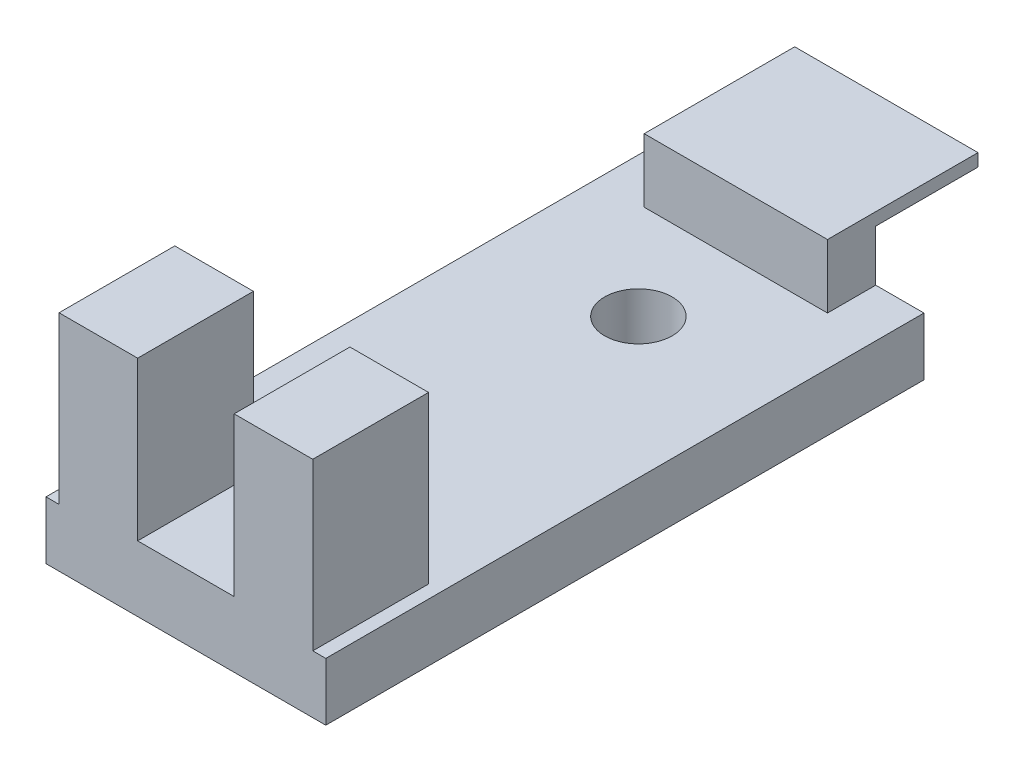
ISO-10303-21;
HEADER;
FILE_DESCRIPTION(('STEP AP214'),'2;1');
FILE_NAME('part.step','',(''),(''),'','','');
FILE_SCHEMA(('AUTOMOTIVE_DESIGN { 1 0 10303 214 1 1 1 1 }'));
ENDSEC;
DATA;
#1=APPLICATION_CONTEXT('core data for automotive mechanical design processes');
#2=APPLICATION_PROTOCOL_DEFINITION('international standard','automotive_design',2000,#1);
#3=PRODUCT_CONTEXT('',#1,'mechanical');
#4=PRODUCT('Part','Part','',(#3));
#5=PRODUCT_RELATED_PRODUCT_CATEGORY('part','',(#4));
#6=PRODUCT_DEFINITION_FORMATION('','',#4);
#7=PRODUCT_DEFINITION_CONTEXT('part definition',#1,'design');
#8=PRODUCT_DEFINITION('design','',#6,#7);
#9=PRODUCT_DEFINITION_SHAPE('','',#8);
#10=(LENGTH_UNIT() NAMED_UNIT(*) SI_UNIT(.MILLI.,.METRE.));
#11=(NAMED_UNIT(*) PLANE_ANGLE_UNIT() SI_UNIT($,.RADIAN.));
#12=(NAMED_UNIT(*) SI_UNIT($,.STERADIAN.) SOLID_ANGLE_UNIT());
#13=UNCERTAINTY_MEASURE_WITH_UNIT(LENGTH_MEASURE(1.E-05),#10,'distance_accuracy_value','');
#14=(GEOMETRIC_REPRESENTATION_CONTEXT(3) GLOBAL_UNCERTAINTY_ASSIGNED_CONTEXT((#13)) GLOBAL_UNIT_ASSIGNED_CONTEXT((#10,
#11,#12)) REPRESENTATION_CONTEXT('',''));
#15=CARTESIAN_POINT('',(0.,0.,0.));
#16=DIRECTION('',(0.,0.,1.));
#17=DIRECTION('',(1.,0.,0.));
#18=AXIS2_PLACEMENT_3D('',#15,#16,#17);
#19=CARTESIAN_POINT('',(-7.25,11.6,9.5));
#20=DIRECTION('',(0.,1.,0.));
#21=DIRECTION('',(0.,0.,1.));
#22=AXIS2_PLACEMENT_3D('',#19,#20,#21);
#23=PLANE('',#22);
#24=DIRECTION('',(0.,0.,1.));
#25=VECTOR('',#24,1.);
#26=CARTESIAN_POINT('',(-2.5,11.6,9.50000000000001));
#27=LINE('',#26,#25);
#28=CARTESIAN_POINT('',(-2.5,11.6,9.50000000000001));
#29=VERTEX_POINT('',#28);
#30=CARTESIAN_POINT('',(-2.5,11.6,15.5));
#31=VERTEX_POINT('',#30);
#32=EDGE_CURVE('E164',#29,#31,#27,.T.);
#33=ORIENTED_EDGE('',*,*,#32,.F.);
#34=DIRECTION('',(1.,0.,0.));
#35=VECTOR('',#34,1.);
#36=CARTESIAN_POINT('',(-7.25,11.6,9.5));
#37=LINE('',#36,#35);
#38=CARTESIAN_POINT('',(-6.575,11.6,9.5));
#39=VERTEX_POINT('',#38);
#40=EDGE_CURVE('E274',#39,#29,#37,.T.);
#41=ORIENTED_EDGE('',*,*,#40,.F.);
#42=DIRECTION('',(0.,0.,-1.));
#43=VECTOR('',#42,1.);
#44=CARTESIAN_POINT('',(-6.575,11.6,0.));
#45=LINE('',#44,#43);
#46=CARTESIAN_POINT('',(-6.575,11.6,15.5));
#47=VERTEX_POINT('',#46);
#48=EDGE_CURVE('E224',#47,#39,#45,.T.);
#49=ORIENTED_EDGE('',*,*,#48,.F.);
#50=DIRECTION('',(1.,0.,0.));
#51=VECTOR('',#50,1.);
#52=CARTESIAN_POINT('',(-7.25,11.6,15.5));
#53=LINE('',#52,#51);
#54=EDGE_CURVE('E271',#47,#31,#53,.T.);
#55=ORIENTED_EDGE('',*,*,#54,.T.);
#56=EDGE_LOOP('',(#33,#41,#49,#55));
#57=FACE_BOUND('',#56,.T.);
#58=ADVANCED_FACE('F33',(#57),#23,.T.);
#59=CARTESIAN_POINT('',(-7.25,11.6,15.5));
#60=DIRECTION('',(0.,0.,1.));
#61=DIRECTION('',(0.,-1.,0.));
#62=AXIS2_PLACEMENT_3D('',#59,#60,#61);
#63=PLANE('',#62);
#64=DIRECTION('',(0.,1.,0.));
#65=VECTOR('',#64,1.);
#66=CARTESIAN_POINT('',(-2.5,3.4,15.5));
#67=LINE('',#66,#65);
#68=CARTESIAN_POINT('',(-2.5,3.4,15.5));
#69=VERTEX_POINT('',#68);
#70=EDGE_CURVE('E159',#69,#31,#67,.T.);
#71=ORIENTED_EDGE('',*,*,#70,.T.);
#72=ORIENTED_EDGE('',*,*,#54,.F.);
#73=DIRECTION('',(0.,-1.,0.));
#74=VECTOR('',#73,1.);
#75=CARTESIAN_POINT('',(-6.575,11.6,15.5));
#76=LINE('',#75,#74);
#77=CARTESIAN_POINT('',(-6.575,3.,15.5));
#78=VERTEX_POINT('',#77);
#79=EDGE_CURVE('E232',#47,#78,#76,.T.);
#80=ORIENTED_EDGE('',*,*,#79,.T.);
#81=DIRECTION('',(1.,0.,0.));
#82=VECTOR('',#81,1.);
#83=CARTESIAN_POINT('',(0.,3.,15.5));
#84=LINE('',#83,#82);
#85=CARTESIAN_POINT('',(-7.25,3.,15.5));
#86=VERTEX_POINT('',#85);
#87=EDGE_CURVE('E209',#86,#78,#84,.T.);
#88=ORIENTED_EDGE('',*,*,#87,.F.);
#89=DIRECTION('',(0.,-1.,0.));
#90=VECTOR('',#89,1.);
#91=CARTESIAN_POINT('',(-7.25,11.6,15.5));
#92=LINE('',#91,#90);
#93=CARTESIAN_POINT('',(-7.25,0.,15.5));
#94=VERTEX_POINT('',#93);
#95=EDGE_CURVE('E261',#86,#94,#92,.T.);
#96=ORIENTED_EDGE('',*,*,#95,.T.);
#97=DIRECTION('',(1.,0.,0.));
#98=VECTOR('',#97,1.);
#99=CARTESIAN_POINT('',(-7.25,0.,15.5));
#100=LINE('',#99,#98);
#101=CARTESIAN_POINT('',(7.25,0.,15.5));
#102=VERTEX_POINT('',#101);
#103=EDGE_CURVE('E270',#94,#102,#100,.T.);
#104=ORIENTED_EDGE('',*,*,#103,.T.);
#105=DIRECTION('',(0.,-1.,0.));
#106=VECTOR('',#105,1.);
#107=CARTESIAN_POINT('',(7.25,11.6,15.5));
#108=LINE('',#107,#106);
#109=CARTESIAN_POINT('',(7.25,3.,15.5));
#110=VERTEX_POINT('',#109);
#111=EDGE_CURVE('E251',#110,#102,#108,.T.);
#112=ORIENTED_EDGE('',*,*,#111,.F.);
#113=DIRECTION('',(-1.,0.,0.));
#114=VECTOR('',#113,1.);
#115=CARTESIAN_POINT('',(0.,3.,15.5));
#116=LINE('',#115,#114);
#117=CARTESIAN_POINT('',(6.575,3.,15.5));
#118=VERTEX_POINT('',#117);
#119=EDGE_CURVE('E200',#110,#118,#116,.T.);
#120=ORIENTED_EDGE('',*,*,#119,.T.);
#121=DIRECTION('',(0.,-1.,0.));
#122=VECTOR('',#121,1.);
#123=CARTESIAN_POINT('',(6.575,11.6,15.5));
#124=LINE('',#123,#122);
#125=CARTESIAN_POINT('',(6.575,11.6,15.5));
#126=VERTEX_POINT('',#125);
#127=EDGE_CURVE('E198',#126,#118,#124,.T.);
#128=ORIENTED_EDGE('',*,*,#127,.F.);
#129=CARTESIAN_POINT('',(2.5,11.6,15.5));
#130=VERTEX_POINT('',#129);
#131=EDGE_CURVE('E273',#130,#126,#53,.T.);
#132=ORIENTED_EDGE('',*,*,#131,.F.);
#133=DIRECTION('',(0.,1.,0.));
#134=VECTOR('',#133,1.);
#135=CARTESIAN_POINT('',(2.5,3.4,15.5));
#136=LINE('',#135,#134);
#137=CARTESIAN_POINT('',(2.5,3.4,15.5));
#138=VERTEX_POINT('',#137);
#139=EDGE_CURVE('E169',#138,#130,#136,.T.);
#140=ORIENTED_EDGE('',*,*,#139,.F.);
#141=DIRECTION('',(1.,0.,0.));
#142=VECTOR('',#141,1.);
#143=CARTESIAN_POINT('',(-2.5,3.4,15.5));
#144=LINE('',#143,#142);
#145=EDGE_CURVE('E173',#69,#138,#144,.T.);
#146=ORIENTED_EDGE('',*,*,#145,.F.);
#147=EDGE_LOOP('',(#71,#72,#80,#88,#96,#104,#112,#120,#128,#132,#140,#146));
#148=FACE_BOUND('',#147,.T.);
#149=ADVANCED_FACE('F35',(#148),#63,.T.);
#150=DIRECTION('',(0.,0.,-1.));
#151=VECTOR('',#150,1.);
#152=CARTESIAN_POINT('',(2.5,11.6,9.50000000000001));
#153=LINE('',#152,#151);
#154=CARTESIAN_POINT('',(2.5,11.6,9.50000000000001));
#155=VERTEX_POINT('',#154);
#156=EDGE_CURVE('E177',#130,#155,#153,.T.);
#157=ORIENTED_EDGE('',*,*,#156,.F.);
#158=ORIENTED_EDGE('',*,*,#131,.T.);
#159=DIRECTION('',(0.,0.,-1.));
#160=VECTOR('',#159,1.);
#161=CARTESIAN_POINT('',(6.575,11.6,0.));
#162=LINE('',#161,#160);
#163=CARTESIAN_POINT('',(6.575,11.6,9.5));
#164=VERTEX_POINT('',#163);
#165=EDGE_CURVE('E195',#126,#164,#162,.T.);
#166=ORIENTED_EDGE('',*,*,#165,.T.);
#167=EDGE_CURVE('E277',#155,#164,#37,.T.);
#168=ORIENTED_EDGE('',*,*,#167,.F.);
#169=EDGE_LOOP('',(#157,#158,#166,#168));
#170=FACE_BOUND('',#169,.T.);
#171=ADVANCED_FACE('F337',(#170),#23,.T.);
#172=CARTESIAN_POINT('',(-7.25,3.,9.5));
#173=DIRECTION('',(0.,0.,-1.));
#174=DIRECTION('',(0.,1.,0.));
#175=AXIS2_PLACEMENT_3D('',#172,#173,#174);
#176=PLANE('',#175);
#177=DIRECTION('',(0.,1.,0.));
#178=VECTOR('',#177,1.);
#179=CARTESIAN_POINT('',(-2.5,3.4,9.5));
#180=LINE('',#179,#178);
#181=CARTESIAN_POINT('',(-2.5,3.4,9.5));
#182=VERTEX_POINT('',#181);
#183=EDGE_CURVE('E188',#182,#29,#180,.T.);
#184=ORIENTED_EDGE('',*,*,#183,.F.);
#185=DIRECTION('',(-1.,0.,0.));
#186=VECTOR('',#185,1.);
#187=CARTESIAN_POINT('',(-2.5,3.4,9.5));
#188=LINE('',#187,#186);
#189=CARTESIAN_POINT('',(2.5,3.4,9.5));
#190=VERTEX_POINT('',#189);
#191=EDGE_CURVE('E170',#190,#182,#188,.T.);
#192=ORIENTED_EDGE('',*,*,#191,.F.);
#193=DIRECTION('',(0.,1.,0.));
#194=VECTOR('',#193,1.);
#195=CARTESIAN_POINT('',(2.5,3.4,9.5));
#196=LINE('',#195,#194);
#197=EDGE_CURVE('E191',#190,#155,#196,.T.);
#198=ORIENTED_EDGE('',*,*,#197,.T.);
#199=ORIENTED_EDGE('',*,*,#167,.T.);
#200=DIRECTION('',(0.,-1.,0.));
#201=VECTOR('',#200,1.);
#202=CARTESIAN_POINT('',(6.575,11.6,9.5));
#203=LINE('',#202,#201);
#204=CARTESIAN_POINT('',(6.575,3.,9.5));
#205=VERTEX_POINT('',#204);
#206=EDGE_CURVE('E206',#164,#205,#203,.T.);
#207=ORIENTED_EDGE('',*,*,#206,.T.);
#208=DIRECTION('',(1.,0.,0.));
#209=VECTOR('',#208,1.);
#210=CARTESIAN_POINT('',(-7.25,3.,9.5));
#211=LINE('',#210,#209);
#212=CARTESIAN_POINT('',(-6.575,3.,9.5));
#213=VERTEX_POINT('',#212);
#214=EDGE_CURVE('E278',#213,#205,#211,.T.);
#215=ORIENTED_EDGE('',*,*,#214,.F.);
#216=DIRECTION('',(0.,-1.,0.));
#217=VECTOR('',#216,1.);
#218=CARTESIAN_POINT('',(-6.575,11.6,9.5));
#219=LINE('',#218,#217);
#220=EDGE_CURVE('E226',#39,#213,#219,.T.);
#221=ORIENTED_EDGE('',*,*,#220,.F.);
#222=ORIENTED_EDGE('',*,*,#40,.T.);
#223=EDGE_LOOP('',(#184,#192,#198,#199,#207,#215,#221,#222));
#224=FACE_BOUND('',#223,.T.);
#225=ADVANCED_FACE('F344',(#224),#176,.T.);
#226=CARTESIAN_POINT('',(-7.25,6.3,-13.));
#227=DIRECTION('',(0.,0.,1.));
#228=DIRECTION('',(1.,0.,0.));
#229=AXIS2_PLACEMENT_3D('',#226,#227,#228);
#230=PLANE('',#229);
#231=DIRECTION('',(1.,0.,0.));
#232=VECTOR('',#231,1.);
#233=CARTESIAN_POINT('',(-7.25,6.3,-13.));
#234=LINE('',#233,#232);
#235=CARTESIAN_POINT('',(-4.75,6.3,-13.));
#236=VERTEX_POINT('',#235);
#237=CARTESIAN_POINT('',(4.75,6.3,-13.));
#238=VERTEX_POINT('',#237);
#239=EDGE_CURVE('E284',#236,#238,#234,.T.);
#240=ORIENTED_EDGE('',*,*,#239,.F.);
#241=DIRECTION('',(0.,-1.,0.));
#242=VECTOR('',#241,1.);
#243=CARTESIAN_POINT('',(-4.75,11.6,-13.));
#244=LINE('',#243,#242);
#245=CARTESIAN_POINT('',(-4.75,3.,-13.));
#246=VERTEX_POINT('',#245);
#247=EDGE_CURVE('E214',#236,#246,#244,.T.);
#248=ORIENTED_EDGE('',*,*,#247,.T.);
#249=DIRECTION('',(1.,0.,0.));
#250=VECTOR('',#249,1.);
#251=CARTESIAN_POINT('',(-7.25,3.,-13.));
#252=LINE('',#251,#250);
#253=CARTESIAN_POINT('',(4.75,3.,-13.));
#254=VERTEX_POINT('',#253);
#255=EDGE_CURVE('E281',#246,#254,#252,.T.);
#256=ORIENTED_EDGE('',*,*,#255,.T.);
#257=DIRECTION('',(0.,-1.,0.));
#258=VECTOR('',#257,1.);
#259=CARTESIAN_POINT('',(4.75,11.6,-13.));
#260=LINE('',#259,#258);
#261=EDGE_CURVE('E203',#238,#254,#260,.T.);
#262=ORIENTED_EDGE('',*,*,#261,.F.);
#263=EDGE_LOOP('',(#240,#248,#256,#262));
#264=FACE_BOUND('',#263,.T.);
#265=ADVANCED_FACE('F318',(#264),#230,.T.);
#266=CARTESIAN_POINT('',(-7.25,6.3,-20.8));
#267=DIRECTION('',(0.,1.,0.));
#268=DIRECTION('',(0.,0.,1.));
#269=AXIS2_PLACEMENT_3D('',#266,#267,#268);
#270=PLANE('',#269);
#271=DIRECTION('',(1.,0.,0.));
#272=VECTOR('',#271,1.);
#273=CARTESIAN_POINT('',(-7.25,6.3,-20.8));
#274=LINE('',#273,#272);
#275=CARTESIAN_POINT('',(-4.75,6.3,-20.8));
#276=VERTEX_POINT('',#275);
#277=CARTESIAN_POINT('',(4.75,6.3,-20.8));
#278=VERTEX_POINT('',#277);
#279=EDGE_CURVE('E287',#276,#278,#274,.T.);
#280=ORIENTED_EDGE('',*,*,#279,.F.);
#281=DIRECTION('',(0.,0.,1.));
#282=VECTOR('',#281,1.);
#283=CARTESIAN_POINT('',(-4.75,6.3,-20.8));
#284=LINE('',#283,#282);
#285=EDGE_CURVE('E248',#276,#236,#284,.T.);
#286=ORIENTED_EDGE('',*,*,#285,.T.);
#287=ORIENTED_EDGE('',*,*,#239,.T.);
#288=DIRECTION('',(0.,0.,1.));
#289=VECTOR('',#288,1.);
#290=CARTESIAN_POINT('',(4.75,6.3,-20.8));
#291=LINE('',#290,#289);
#292=EDGE_CURVE('E243',#278,#238,#291,.T.);
#293=ORIENTED_EDGE('',*,*,#292,.F.);
#294=EDGE_LOOP('',(#280,#286,#287,#293));
#295=FACE_BOUND('',#294,.T.);
#296=ADVANCED_FACE('F322',(#295),#270,.T.);
#297=CARTESIAN_POINT('',(-7.25,5.65,-20.8));
#298=DIRECTION('',(0.,0.,-1.));
#299=DIRECTION('',(0.,1.,0.));
#300=AXIS2_PLACEMENT_3D('',#297,#298,#299);
#301=PLANE('',#300);
#302=DIRECTION('',(1.,0.,0.));
#303=VECTOR('',#302,1.);
#304=CARTESIAN_POINT('',(-7.25,5.65,-20.8));
#305=LINE('',#304,#303);
#306=CARTESIAN_POINT('',(-4.75,5.65,-20.8));
#307=VERTEX_POINT('',#306);
#308=CARTESIAN_POINT('',(4.75,5.65,-20.8));
#309=VERTEX_POINT('',#308);
#310=EDGE_CURVE('E290',#307,#309,#305,.T.);
#311=ORIENTED_EDGE('',*,*,#310,.F.);
#312=DIRECTION('',(0.,-1.,0.));
#313=VECTOR('',#312,1.);
#314=CARTESIAN_POINT('',(-4.75,11.6,-20.8));
#315=LINE('',#314,#313);
#316=EDGE_CURVE('E220',#276,#307,#315,.T.);
#317=ORIENTED_EDGE('',*,*,#316,.F.);
#318=ORIENTED_EDGE('',*,*,#279,.T.);
#319=DIRECTION('',(0.,-1.,0.));
#320=VECTOR('',#319,1.);
#321=CARTESIAN_POINT('',(4.75,11.6,-20.8));
#322=LINE('',#321,#320);
#323=EDGE_CURVE('E213',#278,#309,#322,.T.);
#324=ORIENTED_EDGE('',*,*,#323,.T.);
#325=EDGE_LOOP('',(#311,#317,#318,#324));
#326=FACE_BOUND('',#325,.T.);
#327=ADVANCED_FACE('F325',(#326),#301,.T.);
#328=CARTESIAN_POINT('',(-7.25,5.65,-15.5));
#329=DIRECTION('',(0.,-1.,0.));
#330=DIRECTION('',(0.,0.,-1.));
#331=AXIS2_PLACEMENT_3D('',#328,#329,#330);
#332=PLANE('',#331);
#333=DIRECTION('',(1.,0.,0.));
#334=VECTOR('',#333,1.);
#335=CARTESIAN_POINT('',(-7.25,5.65,-15.5));
#336=LINE('',#335,#334);
#337=CARTESIAN_POINT('',(-4.75,5.65,-15.5));
#338=VERTEX_POINT('',#337);
#339=CARTESIAN_POINT('',(4.75,5.65,-15.5));
#340=VERTEX_POINT('',#339);
#341=EDGE_CURVE('E293',#338,#340,#336,.T.);
#342=ORIENTED_EDGE('',*,*,#341,.F.);
#343=DIRECTION('',(0.,0.,-1.));
#344=VECTOR('',#343,1.);
#345=CARTESIAN_POINT('',(-4.75,5.65,-15.5));
#346=LINE('',#345,#344);
#347=EDGE_CURVE('E245',#338,#307,#346,.T.);
#348=ORIENTED_EDGE('',*,*,#347,.T.);
#349=ORIENTED_EDGE('',*,*,#310,.T.);
#350=DIRECTION('',(0.,0.,-1.));
#351=VECTOR('',#350,1.);
#352=CARTESIAN_POINT('',(4.75,5.65,-15.5));
#353=LINE('',#352,#351);
#354=EDGE_CURVE('E241',#340,#309,#353,.T.);
#355=ORIENTED_EDGE('',*,*,#354,.F.);
#356=EDGE_LOOP('',(#342,#348,#349,#355));
#357=FACE_BOUND('',#356,.T.);
#358=ADVANCED_FACE('F307',(#357),#332,.T.);
#359=CARTESIAN_POINT('',(-7.25,0.,-15.5));
#360=DIRECTION('',(0.,0.,-1.));
#361=DIRECTION('',(0.,1.,0.));
#362=AXIS2_PLACEMENT_3D('',#359,#360,#361);
#363=PLANE('',#362);
#364=DIRECTION('',(1.,0.,0.));
#365=VECTOR('',#364,1.);
#366=CARTESIAN_POINT('',(-7.25,3.,-15.5));
#367=LINE('',#366,#365);
#368=CARTESIAN_POINT('',(-7.25,3.,-15.5));
#369=VERTEX_POINT('',#368);
#370=CARTESIAN_POINT('',(-4.75,3.,-15.5));
#371=VERTEX_POINT('',#370);
#372=EDGE_CURVE('E238',#369,#371,#367,.T.);
#373=ORIENTED_EDGE('',*,*,#372,.T.);
#374=DIRECTION('',(0.,1.,0.));
#375=VECTOR('',#374,1.);
#376=CARTESIAN_POINT('',(-4.75,0.,-15.5));
#377=LINE('',#376,#375);
#378=EDGE_CURVE('E11',#371,#338,#377,.T.);
#379=ORIENTED_EDGE('',*,*,#378,.T.);
#380=ORIENTED_EDGE('',*,*,#341,.T.);
#381=DIRECTION('',(0.,1.,0.));
#382=VECTOR('',#381,1.);
#383=CARTESIAN_POINT('',(4.75,0.,-15.5));
#384=LINE('',#383,#382);
#385=CARTESIAN_POINT('',(4.75,3.,-15.5));
#386=VERTEX_POINT('',#385);
#387=EDGE_CURVE('E41',#386,#340,#384,.T.);
#388=ORIENTED_EDGE('',*,*,#387,.F.);
#389=DIRECTION('',(1.,0.,0.));
#390=VECTOR('',#389,1.);
#391=CARTESIAN_POINT('',(-7.25,3.,-15.5));
#392=LINE('',#391,#390);
#393=CARTESIAN_POINT('',(7.25,3.,-15.5));
#394=VERTEX_POINT('',#393);
#395=EDGE_CURVE('E235',#386,#394,#392,.T.);
#396=ORIENTED_EDGE('',*,*,#395,.T.);
#397=DIRECTION('',(0.,1.,0.));
#398=VECTOR('',#397,1.);
#399=CARTESIAN_POINT('',(7.25,0.,-15.5));
#400=LINE('',#399,#398);
#401=CARTESIAN_POINT('',(7.25,0.,-15.5));
#402=VERTEX_POINT('',#401);
#403=EDGE_CURVE('E256',#402,#394,#400,.T.);
#404=ORIENTED_EDGE('',*,*,#403,.F.);
#405=DIRECTION('',(1.,0.,0.));
#406=VECTOR('',#405,1.);
#407=CARTESIAN_POINT('',(-7.25,0.,-15.5));
#408=LINE('',#407,#406);
#409=CARTESIAN_POINT('',(-7.25,0.,-15.5));
#410=VERTEX_POINT('',#409);
#411=EDGE_CURVE('E296',#410,#402,#408,.T.);
#412=ORIENTED_EDGE('',*,*,#411,.F.);
#413=DIRECTION('',(0.,1.,0.));
#414=VECTOR('',#413,1.);
#415=CARTESIAN_POINT('',(-7.25,0.,-15.5));
#416=LINE('',#415,#414);
#417=EDGE_CURVE('E266',#410,#369,#416,.T.);
#418=ORIENTED_EDGE('',*,*,#417,.T.);
#419=EDGE_LOOP('',(#373,#379,#380,#388,#396,#404,#412,#418));
#420=FACE_BOUND('',#419,.T.);
#421=ADVANCED_FACE('F309',(#420),#363,.T.);
#422=CARTESIAN_POINT('',(-7.25,0.,0.));
#423=DIRECTION('',(1.,0.,0.));
#424=DIRECTION('',(0.,0.,-1.));
#425=AXIS2_PLACEMENT_3D('',#422,#423,#424);
#426=PLANE('',#425);
#427=DIRECTION('',(0.,0.,1.));
#428=VECTOR('',#427,1.);
#429=CARTESIAN_POINT('',(-7.25,3.,-13.));
#430=LINE('',#429,#428);
#431=EDGE_CURVE('E56',#369,#86,#430,.T.);
#432=ORIENTED_EDGE('',*,*,#431,.F.);
#433=ORIENTED_EDGE('',*,*,#417,.F.);
#434=DIRECTION('',(0.,0.,-1.));
#435=VECTOR('',#434,1.);
#436=CARTESIAN_POINT('',(-7.25,0.,15.5));
#437=LINE('',#436,#435);
#438=EDGE_CURVE('E263',#94,#410,#437,.T.);
#439=ORIENTED_EDGE('',*,*,#438,.F.);
#440=ORIENTED_EDGE('',*,*,#95,.F.);
#441=EDGE_LOOP('',(#432,#433,#439,#440));
#442=FACE_BOUND('',#441,.T.);
#443=ADVANCED_FACE('F390',(#442),#426,.F.);
#444=CARTESIAN_POINT('',(7.25,0.,0.));
#445=DIRECTION('',(1.,0.,0.));
#446=DIRECTION('',(0.,0.,-1.));
#447=AXIS2_PLACEMENT_3D('',#444,#445,#446);
#448=PLANE('',#447);
#449=ORIENTED_EDGE('',*,*,#403,.T.);
#450=DIRECTION('',(0.,0.,1.));
#451=VECTOR('',#450,1.);
#452=CARTESIAN_POINT('',(7.25,3.,-13.));
#453=LINE('',#452,#451);
#454=EDGE_CURVE('E259',#394,#110,#453,.T.);
#455=ORIENTED_EDGE('',*,*,#454,.T.);
#456=ORIENTED_EDGE('',*,*,#111,.T.);
#457=DIRECTION('',(0.,0.,-1.));
#458=VECTOR('',#457,1.);
#459=CARTESIAN_POINT('',(7.25,0.,15.5));
#460=LINE('',#459,#458);
#461=EDGE_CURVE('E253',#102,#402,#460,.T.);
#462=ORIENTED_EDGE('',*,*,#461,.T.);
#463=EDGE_LOOP('',(#449,#455,#456,#462));
#464=FACE_BOUND('',#463,.T.);
#465=ADVANCED_FACE('F388',(#464),#448,.T.);
#466=CARTESIAN_POINT('',(-7.25,3.,-13.));
#467=DIRECTION('',(0.,1.,0.));
#468=DIRECTION('',(0.,0.,1.));
#469=AXIS2_PLACEMENT_3D('',#466,#467,#468);
#470=PLANE('',#469);
#471=CARTESIAN_POINT('',(0.,3.,-7.95));
#472=DIRECTION('',(0.,1.,0.));
#473=DIRECTION('',(0.,0.,1.));
#474=AXIS2_PLACEMENT_3D('',#471,#472,#473);
#475=CIRCLE('',#474,1.75);
#476=CARTESIAN_POINT('',(0.,3.,-6.2));
#477=VERTEX_POINT('',#476);
#478=EDGE_CURVE('E416',#477,#477,#475,.T.);
#479=ORIENTED_EDGE('',*,*,#478,.F.);
#480=EDGE_LOOP('',(#479));
#481=FACE_BOUND('',#480,.T.);
#482=ORIENTED_EDGE('',*,*,#431,.T.);
#483=ORIENTED_EDGE('',*,*,#87,.T.);
#484=DIRECTION('',(0.,0.,-1.));
#485=VECTOR('',#484,1.);
#486=CARTESIAN_POINT('',(-6.575,3.,0.));
#487=LINE('',#486,#485);
#488=EDGE_CURVE('E227',#78,#213,#487,.T.);
#489=ORIENTED_EDGE('',*,*,#488,.T.);
#490=ORIENTED_EDGE('',*,*,#214,.T.);
#491=DIRECTION('',(0.,0.,-1.));
#492=VECTOR('',#491,1.);
#493=CARTESIAN_POINT('',(6.575,3.,0.));
#494=LINE('',#493,#492);
#495=EDGE_CURVE('E199',#118,#205,#494,.T.);
#496=ORIENTED_EDGE('',*,*,#495,.F.);
#497=ORIENTED_EDGE('',*,*,#119,.F.);
#498=ORIENTED_EDGE('',*,*,#454,.F.);
#499=ORIENTED_EDGE('',*,*,#395,.F.);
#500=DIRECTION('',(0.,0.,-1.));
#501=VECTOR('',#500,1.);
#502=CARTESIAN_POINT('',(4.75,3.,0.));
#503=LINE('',#502,#501);
#504=EDGE_CURVE('E210',#254,#386,#503,.T.);
#505=ORIENTED_EDGE('',*,*,#504,.F.);
#506=ORIENTED_EDGE('',*,*,#255,.F.);
#507=DIRECTION('',(0.,0.,-1.));
#508=VECTOR('',#507,1.);
#509=CARTESIAN_POINT('',(-4.75,3.,0.));
#510=LINE('',#509,#508);
#511=EDGE_CURVE('E190',#246,#371,#510,.T.);
#512=ORIENTED_EDGE('',*,*,#511,.T.);
#513=ORIENTED_EDGE('',*,*,#372,.F.);
#514=EDGE_LOOP('',(#482,#483,#489,#490,#496,#497,#498,#499,#505,#506,#512,#513));
#515=FACE_BOUND('',#514,.T.);
#516=ADVANCED_FACE('F314',(#481,#515),#470,.T.);
#517=CARTESIAN_POINT('',(-7.25,0.,15.5));
#518=DIRECTION('',(0.,-1.,0.));
#519=DIRECTION('',(0.,0.,-1.));
#520=AXIS2_PLACEMENT_3D('',#517,#518,#519);
#521=PLANE('',#520);
#522=CARTESIAN_POINT('',(0.,0.,-7.95));
#523=DIRECTION('',(0.,1.,0.));
#524=DIRECTION('',(0.,0.,1.));
#525=AXIS2_PLACEMENT_3D('',#522,#523,#524);
#526=CIRCLE('',#525,1.75);
#527=CARTESIAN_POINT('',(0.,0.,-6.2));
#528=VERTEX_POINT('',#527);
#529=EDGE_CURVE('E186',#528,#528,#526,.T.);
#530=ORIENTED_EDGE('',*,*,#529,.T.);
#531=EDGE_LOOP('',(#530));
#532=FACE_BOUND('',#531,.T.);
#533=ORIENTED_EDGE('',*,*,#411,.T.);
#534=ORIENTED_EDGE('',*,*,#461,.F.);
#535=ORIENTED_EDGE('',*,*,#103,.F.);
#536=ORIENTED_EDGE('',*,*,#438,.T.);
#537=EDGE_LOOP('',(#533,#534,#535,#536));
#538=FACE_BOUND('',#537,.T.);
#539=ADVANCED_FACE('F379',(#532,#538),#521,.T.);
#540=CARTESIAN_POINT('',(6.575,11.6,0.));
#541=DIRECTION('',(-1.,0.,0.));
#542=DIRECTION('',(0.,0.,1.));
#543=AXIS2_PLACEMENT_3D('',#540,#541,#542);
#544=PLANE('',#543);
#545=ORIENTED_EDGE('',*,*,#495,.T.);
#546=ORIENTED_EDGE('',*,*,#206,.F.);
#547=ORIENTED_EDGE('',*,*,#165,.F.);
#548=ORIENTED_EDGE('',*,*,#127,.T.);
#549=EDGE_LOOP('',(#545,#546,#547,#548));
#550=FACE_BOUND('',#549,.T.);
#551=ADVANCED_FACE('F359',(#550),#544,.F.);
#552=CARTESIAN_POINT('',(4.75,11.6,0.));
#553=DIRECTION('',(-1.,0.,0.));
#554=DIRECTION('',(0.,0.,1.));
#555=AXIS2_PLACEMENT_3D('',#552,#553,#554);
#556=PLANE('',#555);
#557=ORIENTED_EDGE('',*,*,#292,.T.);
#558=ORIENTED_EDGE('',*,*,#261,.T.);
#559=ORIENTED_EDGE('',*,*,#504,.T.);
#560=ORIENTED_EDGE('',*,*,#387,.T.);
#561=ORIENTED_EDGE('',*,*,#354,.T.);
#562=ORIENTED_EDGE('',*,*,#323,.F.);
#563=EDGE_LOOP('',(#557,#558,#559,#560,#561,#562));
#564=FACE_BOUND('',#563,.T.);
#565=ADVANCED_FACE('F302',(#564),#556,.F.);
#566=CARTESIAN_POINT('',(-6.575,11.6,0.));
#567=DIRECTION('',(-1.,0.,0.));
#568=DIRECTION('',(0.,0.,1.));
#569=AXIS2_PLACEMENT_3D('',#566,#567,#568);
#570=PLANE('',#569);
#571=ORIENTED_EDGE('',*,*,#488,.F.);
#572=ORIENTED_EDGE('',*,*,#79,.F.);
#573=ORIENTED_EDGE('',*,*,#48,.T.);
#574=ORIENTED_EDGE('',*,*,#220,.T.);
#575=EDGE_LOOP('',(#571,#572,#573,#574));
#576=FACE_BOUND('',#575,.T.);
#577=ADVANCED_FACE('F382',(#576),#570,.T.);
#578=CARTESIAN_POINT('',(-4.75,11.6,0.));
#579=DIRECTION('',(-1.,0.,0.));
#580=DIRECTION('',(0.,0.,1.));
#581=AXIS2_PLACEMENT_3D('',#578,#579,#580);
#582=PLANE('',#581);
#583=ORIENTED_EDGE('',*,*,#316,.T.);
#584=ORIENTED_EDGE('',*,*,#347,.F.);
#585=ORIENTED_EDGE('',*,*,#378,.F.);
#586=ORIENTED_EDGE('',*,*,#511,.F.);
#587=ORIENTED_EDGE('',*,*,#247,.F.);
#588=ORIENTED_EDGE('',*,*,#285,.F.);
#589=EDGE_LOOP('',(#583,#584,#585,#586,#587,#588));
#590=FACE_BOUND('',#589,.T.);
#591=ADVANCED_FACE('F311',(#590),#582,.T.);
#592=CARTESIAN_POINT('',(-2.5,3.4,9.5));
#593=DIRECTION('',(-1.,0.,0.));
#594=DIRECTION('',(0.,0.,1.));
#595=AXIS2_PLACEMENT_3D('',#592,#593,#594);
#596=PLANE('',#595);
#597=ORIENTED_EDGE('',*,*,#32,.T.);
#598=ORIENTED_EDGE('',*,*,#70,.F.);
#599=DIRECTION('',(0.,0.,1.));
#600=VECTOR('',#599,1.);
#601=CARTESIAN_POINT('',(-2.5,3.4,9.5));
#602=LINE('',#601,#600);
#603=EDGE_CURVE('E162',#182,#69,#602,.T.);
#604=ORIENTED_EDGE('',*,*,#603,.F.);
#605=ORIENTED_EDGE('',*,*,#183,.T.);
#606=EDGE_LOOP('',(#597,#598,#604,#605));
#607=FACE_BOUND('',#606,.T.);
#608=ADVANCED_FACE('F161',(#607),#596,.F.);
#609=CARTESIAN_POINT('',(2.5,3.4,9.5));
#610=DIRECTION('',(1.,0.,0.));
#611=DIRECTION('',(0.,0.,-1.));
#612=AXIS2_PLACEMENT_3D('',#609,#610,#611);
#613=PLANE('',#612);
#614=ORIENTED_EDGE('',*,*,#156,.T.);
#615=ORIENTED_EDGE('',*,*,#197,.F.);
#616=DIRECTION('',(0.,0.,-1.));
#617=VECTOR('',#616,1.);
#618=CARTESIAN_POINT('',(2.5,3.4,9.5));
#619=LINE('',#618,#617);
#620=EDGE_CURVE('E48',#138,#190,#619,.T.);
#621=ORIENTED_EDGE('',*,*,#620,.F.);
#622=ORIENTED_EDGE('',*,*,#139,.T.);
#623=EDGE_LOOP('',(#614,#615,#621,#622));
#624=FACE_BOUND('',#623,.T.);
#625=ADVANCED_FACE('F365',(#624),#613,.F.);
#626=CARTESIAN_POINT('',(0.,3.40000000000001,0.));
#627=DIRECTION('',(0.,1.,0.));
#628=DIRECTION('',(0.,0.,1.));
#629=AXIS2_PLACEMENT_3D('',#626,#627,#628);
#630=PLANE('',#629);
#631=ORIENTED_EDGE('',*,*,#603,.T.);
#632=ORIENTED_EDGE('',*,*,#145,.T.);
#633=ORIENTED_EDGE('',*,*,#620,.T.);
#634=ORIENTED_EDGE('',*,*,#191,.T.);
#635=EDGE_LOOP('',(#631,#632,#633,#634));
#636=FACE_BOUND('',#635,.T.);
#637=ADVANCED_FACE('F172',(#636),#630,.T.);
#638=CARTESIAN_POINT('',(0.,0.,-7.95));
#639=DIRECTION('',(0.,1.,0.));
#640=DIRECTION('',(0.,0.,1.));
#641=AXIS2_PLACEMENT_3D('',#638,#639,#640);
#642=CYLINDRICAL_SURFACE('',#641,1.75);
#643=ORIENTED_EDGE('',*,*,#529,.F.);
#644=EDGE_LOOP('',(#643));
#645=FACE_BOUND('',#644,.T.);
#646=ORIENTED_EDGE('',*,*,#478,.T.);
#647=EDGE_LOOP('',(#646));
#648=FACE_BOUND('',#647,.T.);
#649=ADVANCED_FACE('F372',(#645,#648),#642,.F.);
#650=CLOSED_SHELL('',(#58,#149,#171,#225,#265,#296,#327,#358,#421,#443,#465,#516,#539,#551,#565,
#577,#591,#608,#625,#637,#649));
#651=MANIFOLD_SOLID_BREP('B2',#650);
#652=ADVANCED_BREP_SHAPE_REPRESENTATION('',(#18,#651),#14);
#653=SHAPE_DEFINITION_REPRESENTATION(#9,#652);
ENDSEC;
END-ISO-10303-21;
